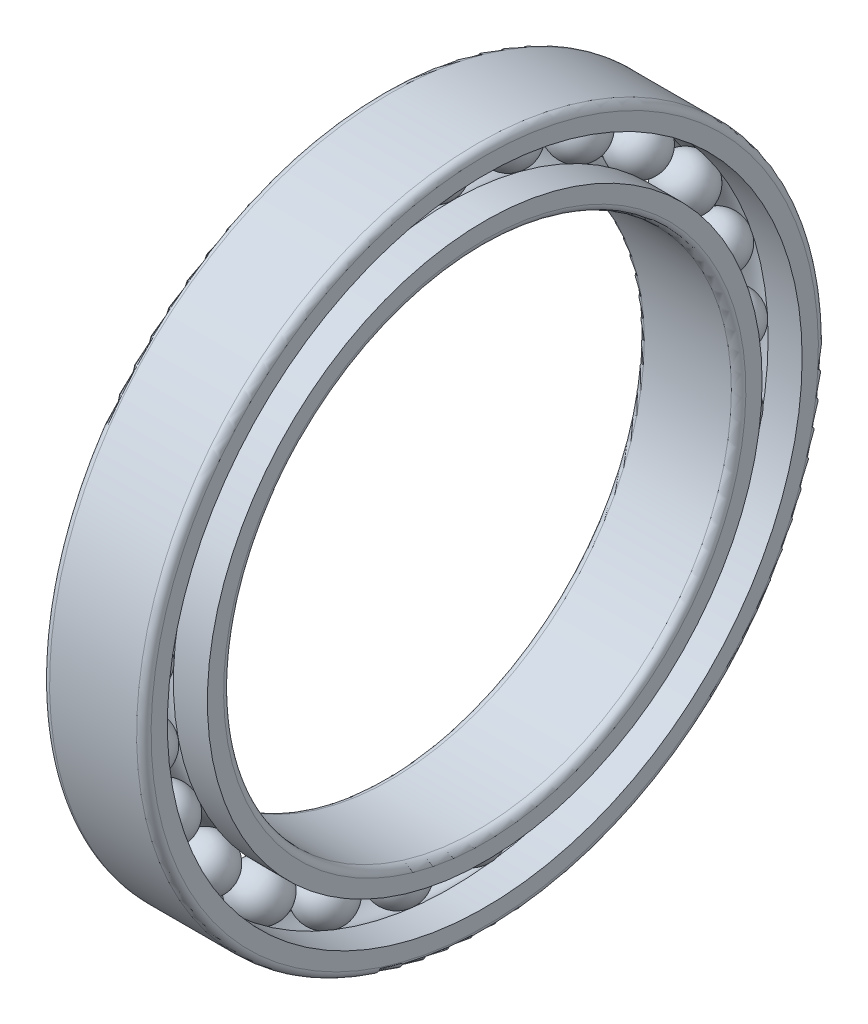
ISO-10303-21;
HEADER;
FILE_DESCRIPTION(('STEP AP214'),'2;1');
FILE_NAME('part.step','',(''),(''),'','','');
FILE_SCHEMA(('AUTOMOTIVE_DESIGN { 1 0 10303 214 1 1 1 1 }'));
ENDSEC;
DATA;
#1=APPLICATION_CONTEXT('core data for automotive mechanical design processes');
#2=APPLICATION_PROTOCOL_DEFINITION('international standard','automotive_design',2000,#1);
#3=PRODUCT_CONTEXT('',#1,'mechanical');
#4=PRODUCT('Part','Part','',(#3));
#5=PRODUCT_RELATED_PRODUCT_CATEGORY('part','',(#4));
#6=PRODUCT_DEFINITION_FORMATION('','',#4);
#7=PRODUCT_DEFINITION_CONTEXT('part definition',#1,'design');
#8=PRODUCT_DEFINITION('design','',#6,#7);
#9=PRODUCT_DEFINITION_SHAPE('','',#8);
#10=(LENGTH_UNIT() NAMED_UNIT(*) SI_UNIT(.MILLI.,.METRE.));
#11=(NAMED_UNIT(*) PLANE_ANGLE_UNIT() SI_UNIT($,.RADIAN.));
#12=(NAMED_UNIT(*) SI_UNIT($,.STERADIAN.) SOLID_ANGLE_UNIT());
#13=UNCERTAINTY_MEASURE_WITH_UNIT(LENGTH_MEASURE(1.E-05),#10,'distance_accuracy_value','');
#14=(GEOMETRIC_REPRESENTATION_CONTEXT(3) GLOBAL_UNCERTAINTY_ASSIGNED_CONTEXT((#13)) GLOBAL_UNIT_ASSIGNED_CONTEXT((#10,
#11,#12)) REPRESENTATION_CONTEXT('',''));
#15=CARTESIAN_POINT('',(0.,0.,0.));
#16=DIRECTION('',(0.,0.,1.));
#17=DIRECTION('',(1.,0.,0.));
#18=AXIS2_PLACEMENT_3D('',#15,#16,#17);
#19=CARTESIAN_POINT('',(0.,6.33484838468643,19.4966585840506));
#20=DIRECTION('',(1.,0.,0.));
#21=DIRECTION('',(0.,-0.951056516295154,0.309016994374948));
#22=AXIS2_PLACEMENT_3D('',#19,#20,#21);
#23=SPHERICAL_SURFACE('',#22,1.8);
#24=CARTESIAN_POINT('',(-1.79999999999999,6.33484838468643,19.4966585840506));
#25=VERTEX_POINT('',#24);
#26=VERTEX_LOOP('',#25);
#27=FACE_BOUND('',#26,.T.);
#28=CARTESIAN_POINT('',(1.80000000000001,6.33484838468643,19.4966585840506));
#29=VERTEX_POINT('',#28);
#30=VERTEX_LOOP('',#29);
#31=FACE_BOUND('',#30,.T.);
#32=ADVANCED_FACE('P0_F15',(#27,#31),#23,.T.);
#33=CLOSED_SHELL('',(#32));
#34=MANIFOLD_SOLID_BREP('P0_B1',#33);
#35=CARTESIAN_POINT('',(0.,-16.5848483846864,-12.0495976719957));
#36=DIRECTION('',(1.,0.,0.));
#37=DIRECTION('',(0.,0.587785252292473,-0.809016994374947));
#38=AXIS2_PLACEMENT_3D('',#35,#36,#37);
#39=SPHERICAL_SURFACE('',#38,1.8);
#40=CARTESIAN_POINT('',(-1.79999999999999,-16.5848483846864,-12.0495976719957));
#41=VERTEX_POINT('',#40);
#42=VERTEX_LOOP('',#41);
#43=FACE_BOUND('',#42,.T.);
#44=CARTESIAN_POINT('',(1.80000000000001,-16.5848483846864,-12.0495976719957));
#45=VERTEX_POINT('',#44);
#46=VERTEX_LOOP('',#45);
#47=FACE_BOUND('',#46,.T.);
#48=ADVANCED_FACE('P1_F15',(#43,#47),#39,.T.);
#49=CLOSED_SHELL('',(#48));
#50=MANIFOLD_SOLID_BREP('P1_B1',#49);
#51=CARTESIAN_POINT('',(0.,10.9844492970694,17.3087224727913));
#52=DIRECTION('',(1.,0.,0.));
#53=DIRECTION('',(0.,-0.844327925502015,0.535826794978997));
#54=AXIS2_PLACEMENT_3D('',#51,#52,#53);
#55=SPHERICAL_SURFACE('',#54,1.8);
#56=CARTESIAN_POINT('',(-1.79999999999999,10.9844492970694,17.3087224727913));
#57=VERTEX_POINT('',#56);
#58=VERTEX_LOOP('',#57);
#59=FACE_BOUND('',#58,.T.);
#60=CARTESIAN_POINT('',(1.80000000000001,10.9844492970694,17.3087224727913));
#61=VERTEX_POINT('',#60);
#62=VERTEX_LOOP('',#61);
#63=FACE_BOUND('',#62,.T.);
#64=ADVANCED_FACE('P2_F15',(#59,#63),#55,.T.);
#65=CLOSED_SHELL('',(#64));
#66=MANIFOLD_SOLID_BREP('P2_B1',#65);
#67=CARTESIAN_POINT('',(0.,-3.84131694900734,20.1368886399381));
#68=DIRECTION('',(1.,0.,0.));
#69=DIRECTION('',(0.,-0.982287250728689,-0.187381314585724));
#70=AXIS2_PLACEMENT_3D('',#67,#68,#69);
#71=SPHERICAL_SURFACE('',#70,1.8);
#72=CARTESIAN_POINT('',(-1.79999999999999,-3.84131694900734,20.1368886399381));
#73=VERTEX_POINT('',#72);
#74=VERTEX_LOOP('',#73);
#75=FACE_BOUND('',#74,.T.);
#76=CARTESIAN_POINT('',(1.80000000000001,-3.84131694900734,20.1368886399381));
#77=VERTEX_POINT('',#76);
#78=VERTEX_LOOP('',#77);
#79=FACE_BOUND('',#78,.T.);
#80=ADVANCED_FACE('P3_F15',(#75,#79),#71,.T.);
#81=CLOSED_SHELL('',(#80));
#82=MANIFOLD_SOLID_BREP('P3_B1',#81);
#83=CARTESIAN_POINT('',(0.,-19.0604179607092,-7.5465533300359));
#84=DIRECTION('',(1.,0.,0.));
#85=DIRECTION('',(0.,0.368124552684678,-0.929776485888252));
#86=AXIS2_PLACEMENT_3D('',#83,#84,#85);
#87=SPHERICAL_SURFACE('',#86,1.8);
#88=CARTESIAN_POINT('',(-1.79999999999999,-19.0604179607092,-7.5465533300359));
#89=VERTEX_POINT('',#88);
#90=VERTEX_LOOP('',#89);
#91=FACE_BOUND('',#90,.T.);
#92=CARTESIAN_POINT('',(1.80000000000001,-19.0604179607092,-7.5465533300359));
#93=VERTEX_POINT('',#92);
#94=VERTEX_LOOP('',#93);
#95=FACE_BOUND('',#94,.T.);
#96=ADVANCED_FACE('P4_F15',(#91,#95),#87,.T.);
#97=CLOSED_SHELL('',(#96));
#98=MANIFOLD_SOLID_BREP('P4_B1',#97);
#99=CARTESIAN_POINT('',(0.,1.28720565035093,20.4595479327796));
#100=DIRECTION('',(1.,0.,0.));
#101=DIRECTION('',(0.,-0.998026728428272,0.0627905195293136));
#102=AXIS2_PLACEMENT_3D('',#99,#100,#101);
#103=SPHERICAL_SURFACE('',#102,1.8);
#104=CARTESIAN_POINT('',(-1.79999999999999,1.28720565035093,20.4595479327796));
#105=VERTEX_POINT('',#104);
#106=VERTEX_LOOP('',#105);
#107=FACE_BOUND('',#106,.T.);
#108=CARTESIAN_POINT('',(1.80000000000001,1.28720565035093,20.4595479327796));
#109=VERTEX_POINT('',#108);
#110=VERTEX_LOOP('',#109);
#111=FACE_BOUND('',#110,.T.);
#112=ADVANCED_FACE('P5_F15',(#107,#111),#103,.T.);
#113=CLOSED_SHELL('',(#112));
#114=MANIFOLD_SOLID_BREP('P5_B1',#113);
#115=CARTESIAN_POINT('',(0.,-13.0671917898481,-15.7955214769037));
#116=DIRECTION('',(1.,0.,0.));
#117=DIRECTION('',(0.,0.770513242775789,-0.63742398974869));
#118=AXIS2_PLACEMENT_3D('',#115,#116,#117);
#119=SPHERICAL_SURFACE('',#118,1.8);
#120=CARTESIAN_POINT('',(-1.79999999999999,-13.0671917898481,-15.7955214769037));
#121=VERTEX_POINT('',#120);
#122=VERTEX_LOOP('',#121);
#123=FACE_BOUND('',#122,.T.);
#124=CARTESIAN_POINT('',(1.80000000000001,-13.0671917898481,-15.7955214769037));
#125=VERTEX_POINT('',#124);
#126=VERTEX_LOOP('',#125);
#127=FACE_BOUND('',#126,.T.);
#128=ADVANCED_FACE('P6_F15',(#123,#127),#119,.T.);
#129=CLOSED_SHELL('',(#128));
#130=MANIFOLD_SOLID_BREP('P6_B1',#129);
#131=CARTESIAN_POINT('',(0.,-8.72847547708399,-18.5489545755534));
#132=DIRECTION('',(1.,0.,0.));
#133=DIRECTION('',(0.,0.90482705246602,-0.425779291565073));
#134=AXIS2_PLACEMENT_3D('',#131,#132,#133);
#135=SPHERICAL_SURFACE('',#134,1.8);
#136=CARTESIAN_POINT('',(-1.79999999999999,-8.72847547708399,-18.5489545755534));
#137=VERTEX_POINT('',#136);
#138=VERTEX_LOOP('',#137);
#139=FACE_BOUND('',#138,.T.);
#140=CARTESIAN_POINT('',(1.80000000000001,-8.72847547708399,-18.5489545755534));
#141=VERTEX_POINT('',#140);
#142=VERTEX_LOOP('',#141);
#143=FACE_BOUND('',#142,.T.);
#144=ADVANCED_FACE('P7_F15',(#139,#143),#135,.T.);
#145=CLOSED_SHELL('',(#144));
#146=MANIFOLD_SOLID_BREP('P7_B1',#145);
#147=CARTESIAN_POINT('',(0.,-3.84131694900736,-20.1368886399381));
#148=DIRECTION('',(1.,0.,0.));
#149=DIRECTION('',(0.,0.982287250728689,-0.187381314585725));
#150=AXIS2_PLACEMENT_3D('',#147,#148,#149);
#151=SPHERICAL_SURFACE('',#150,1.8);
#152=CARTESIAN_POINT('',(-1.79999999999999,-3.84131694900736,-20.1368886399381));
#153=VERTEX_POINT('',#152);
#154=VERTEX_LOOP('',#153);
#155=FACE_BOUND('',#154,.T.);
#156=CARTESIAN_POINT('',(1.80000000000001,-3.84131694900736,-20.1368886399381));
#157=VERTEX_POINT('',#156);
#158=VERTEX_LOOP('',#157);
#159=FACE_BOUND('',#158,.T.);
#160=ADVANCED_FACE('P8_F15',(#155,#159),#151,.T.);
#161=CLOSED_SHELL('',(#160));
#162=MANIFOLD_SOLID_BREP('P8_B1',#161);
#163=CARTESIAN_POINT('',(0.,1.28720565035092,-20.4595479327796));
#164=DIRECTION('',(1.,0.,0.));
#165=DIRECTION('',(0.,0.998026728428272,0.0627905195293134));
#166=AXIS2_PLACEMENT_3D('',#163,#164,#165);
#167=SPHERICAL_SURFACE('',#166,1.8);
#168=CARTESIAN_POINT('',(-1.79999999999999,1.28720565035092,-20.4595479327796));
#169=VERTEX_POINT('',#168);
#170=VERTEX_LOOP('',#169);
#171=FACE_BOUND('',#170,.T.);
#172=CARTESIAN_POINT('',(1.80000000000001,1.28720565035092,-20.4595479327796));
#173=VERTEX_POINT('',#172);
#174=VERTEX_LOOP('',#173);
#175=FACE_BOUND('',#174,.T.);
#176=ADVANCED_FACE('P9_F15',(#171,#175),#167,.T.);
#177=CLOSED_SHELL('',(#176));
#178=MANIFOLD_SOLID_BREP('P9_B1',#177);
#179=CARTESIAN_POINT('',(0.,6.33484838468643,-19.4966585840506));
#180=DIRECTION('',(1.,0.,0.));
#181=DIRECTION('',(0.,0.951056516295154,0.309016994374948));
#182=AXIS2_PLACEMENT_3D('',#179,#180,#181);
#183=SPHERICAL_SURFACE('',#182,1.8);
#184=CARTESIAN_POINT('',(-1.79999999999999,6.33484838468643,-19.4966585840506));
#185=VERTEX_POINT('',#184);
#186=VERTEX_LOOP('',#185);
#187=FACE_BOUND('',#186,.T.);
#188=CARTESIAN_POINT('',(1.80000000000001,6.33484838468643,-19.4966585840506));
#189=VERTEX_POINT('',#188);
#190=VERTEX_LOOP('',#189);
#191=FACE_BOUND('',#190,.T.);
#192=ADVANCED_FACE('P10_F15',(#187,#191),#183,.T.);
#193=CLOSED_SHELL('',(#192));
#194=MANIFOLD_SOLID_BREP('P10_B1',#193);
#195=CARTESIAN_POINT('',(0.,10.9844492970694,-17.3087224727913));
#196=DIRECTION('',(1.,0.,0.));
#197=DIRECTION('',(0.,0.844327925502015,0.535826794978997));
#198=AXIS2_PLACEMENT_3D('',#195,#196,#197);
#199=SPHERICAL_SURFACE('',#198,1.8);
#200=CARTESIAN_POINT('',(-1.79999999999999,10.9844492970694,-17.3087224727913));
#201=VERTEX_POINT('',#200);
#202=VERTEX_LOOP('',#201);
#203=FACE_BOUND('',#202,.T.);
#204=CARTESIAN_POINT('',(1.80000000000001,10.9844492970694,-17.3087224727913));
#205=VERTEX_POINT('',#204);
#206=VERTEX_LOOP('',#205);
#207=FACE_BOUND('',#206,.T.);
#208=ADVANCED_FACE('P11_F15',(#203,#207),#199,.T.);
#209=CLOSED_SHELL('',(#208));
#210=MANIFOLD_SOLID_BREP('P11_B1',#209);
#211=CARTESIAN_POINT('',(0.,14.9438568621389,-14.0332156715381));
#212=DIRECTION('',(1.,0.,0.));
#213=DIRECTION('',(0.,0.684547105928689,0.728968627421412));
#214=AXIS2_PLACEMENT_3D('',#211,#212,#213);
#215=SPHERICAL_SURFACE('',#214,1.8);
#216=CARTESIAN_POINT('',(-1.79999999999999,14.9438568621389,-14.0332156715381));
#217=VERTEX_POINT('',#216);
#218=VERTEX_LOOP('',#217);
#219=FACE_BOUND('',#218,.T.);
#220=CARTESIAN_POINT('',(1.80000000000001,14.9438568621389,-14.0332156715381));
#221=VERTEX_POINT('',#220);
#222=VERTEX_LOOP('',#221);
#223=FACE_BOUND('',#222,.T.);
#224=ADVANCED_FACE('P12_F15',(#219,#223),#215,.T.);
#225=CLOSED_SHELL('',(#224));
#226=MANIFOLD_SOLID_BREP('P12_B1',#225);
#227=CARTESIAN_POINT('',(0.,17.9642869408992,-9.87595031908516));
#228=DIRECTION('',(1.,0.,0.));
#229=DIRECTION('',(0.,0.481753674101715,0.876306680043864));
#230=AXIS2_PLACEMENT_3D('',#227,#228,#229);
#231=SPHERICAL_SURFACE('',#230,1.8);
#232=CARTESIAN_POINT('',(-1.79999999999999,17.9642869408992,-9.87595031908516));
#233=VERTEX_POINT('',#232);
#234=VERTEX_LOOP('',#233);
#235=FACE_BOUND('',#234,.T.);
#236=CARTESIAN_POINT('',(1.80000000000001,17.9642869408992,-9.87595031908516));
#237=VERTEX_POINT('',#236);
#238=VERTEX_LOOP('',#237);
#239=FACE_BOUND('',#238,.T.);
#240=ADVANCED_FACE('P13_F15',(#235,#239),#231,.T.);
#241=CLOSED_SHELL('',(#240));
#242=MANIFOLD_SOLID_BREP('P13_B1',#241);
#243=CARTESIAN_POINT('',(0.,19.8559548031369,-5.09814268687953));
#244=DIRECTION('',(1.,0.,0.));
#245=DIRECTION('',(0.,0.248689887164855,0.968583161128631));
#246=AXIS2_PLACEMENT_3D('',#243,#244,#245);
#247=SPHERICAL_SURFACE('',#246,1.8);
#248=CARTESIAN_POINT('',(-1.79999999999999,19.8559548031369,-5.09814268687953));
#249=VERTEX_POINT('',#248);
#250=VERTEX_LOOP('',#249);
#251=FACE_BOUND('',#250,.T.);
#252=CARTESIAN_POINT('',(1.80000000000001,19.8559548031369,-5.09814268687953));
#253=VERTEX_POINT('',#252);
#254=VERTEX_LOOP('',#253);
#255=FACE_BOUND('',#254,.T.);
#256=ADVANCED_FACE('P14_F15',(#251,#255),#247,.T.);
#257=CLOSED_SHELL('',(#256));
#258=MANIFOLD_SOLID_BREP('P14_B1',#257);
#259=CARTESIAN_POINT('',(0.,20.5,0.));
#260=DIRECTION('',(1.,0.,0.));
#261=DIRECTION('',(0.,0.,1.));
#262=AXIS2_PLACEMENT_3D('',#259,#260,#261);
#263=SPHERICAL_SURFACE('',#262,1.8);
#264=CARTESIAN_POINT('',(-1.79999999999999,20.5,0.));
#265=VERTEX_POINT('',#264);
#266=VERTEX_LOOP('',#265);
#267=FACE_BOUND('',#266,.T.);
#268=CARTESIAN_POINT('',(1.80000000000001,20.5,0.));
#269=VERTEX_POINT('',#268);
#270=VERTEX_LOOP('',#269);
#271=FACE_BOUND('',#270,.T.);
#272=ADVANCED_FACE('P15_F15',(#267,#271),#263,.T.);
#273=CLOSED_SHELL('',(#272));
#274=MANIFOLD_SOLID_BREP('P15_B1',#273);
#275=CARTESIAN_POINT('',(0.,0.,0.));
#276=DIRECTION('',(1.,0.,0.));
#277=DIRECTION('',(0.,1.,0.));
#278=AXIS2_PLACEMENT_3D('',#275,#276,#277);
#279=TOROIDAL_SURFACE('',#278,20.5,1.8);
#280=CARTESIAN_POINT('',(-1.1556816170555,0.,0.));
#281=DIRECTION('',(1.,0.,0.));
#282=DIRECTION('',(0.,0.,-1.));
#283=AXIS2_PLACEMENT_3D('',#280,#281,#282);
#284=CIRCLE('',#283,21.88);
#285=CARTESIAN_POINT('',(-1.1556816170555,0.,-21.88));
#286=VERTEX_POINT('',#285);
#287=EDGE_CURVE('P16_E109',#286,#286,#284,.F.);
#288=ORIENTED_EDGE('',*,*,#287,.T.);
#289=EDGE_LOOP('',(#288));
#290=FACE_BOUND('',#289,.T.);
#291=CARTESIAN_POINT('',(1.1556816170555,0.,0.));
#292=DIRECTION('',(1.,0.,0.));
#293=DIRECTION('',(0.,0.,-1.));
#294=AXIS2_PLACEMENT_3D('',#291,#292,#293);
#295=CIRCLE('',#294,21.88);
#296=CARTESIAN_POINT('',(1.1556816170555,0.,-21.88));
#297=VERTEX_POINT('',#296);
#298=EDGE_CURVE('P16_E114',#297,#297,#295,.T.);
#299=ORIENTED_EDGE('',*,*,#298,.T.);
#300=EDGE_LOOP('',(#299));
#301=FACE_BOUND('',#300,.T.);
#302=ADVANCED_FACE('P16_F14',(#290,#301),#279,.F.);
#303=CARTESIAN_POINT('',(3.50000000000002,0.,0.));
#304=DIRECTION('',(1.,0.,0.));
#305=DIRECTION('',(0.,0.,-1.));
#306=AXIS2_PLACEMENT_3D('',#303,#304,#305);
#307=CYLINDRICAL_SURFACE('',#306,21.88);
#308=ORIENTED_EDGE('',*,*,#298,.F.);
#309=EDGE_LOOP('',(#308));
#310=FACE_BOUND('',#309,.T.);
#311=CARTESIAN_POINT('',(3.50000000000002,0.,0.));
#312=DIRECTION('',(1.,0.,0.));
#313=DIRECTION('',(0.,0.,-1.));
#314=AXIS2_PLACEMENT_3D('',#311,#312,#313);
#315=CIRCLE('',#314,21.88);
#316=CARTESIAN_POINT('',(3.50000000000002,0.,-21.88));
#317=VERTEX_POINT('',#316);
#318=EDGE_CURVE('P16_E18',#317,#317,#315,.F.);
#319=ORIENTED_EDGE('',*,*,#318,.F.);
#320=EDGE_LOOP('',(#319));
#321=FACE_BOUND('',#320,.T.);
#322=ADVANCED_FACE('P16_F85',(#310,#321),#307,.F.);
#323=CARTESIAN_POINT('',(3.50000000000002,0.,0.));
#324=DIRECTION('',(1.,0.,0.));
#325=DIRECTION('',(0.,0.,-1.));
#326=AXIS2_PLACEMENT_3D('',#323,#324,#325);
#327=CYLINDRICAL_SURFACE('',#326,21.88);
#328=CARTESIAN_POINT('',(-3.49999999999998,0.,0.));
#329=DIRECTION('',(1.,0.,0.));
#330=DIRECTION('',(0.,0.,-1.));
#331=AXIS2_PLACEMENT_3D('',#328,#329,#330);
#332=CIRCLE('',#331,21.88);
#333=CARTESIAN_POINT('',(-3.49999999999998,0.,-21.88));
#334=VERTEX_POINT('',#333);
#335=EDGE_CURVE('P16_E104',#334,#334,#332,.T.);
#336=ORIENTED_EDGE('',*,*,#335,.F.);
#337=EDGE_LOOP('',(#336));
#338=FACE_BOUND('',#337,.T.);
#339=ORIENTED_EDGE('',*,*,#287,.F.);
#340=EDGE_LOOP('',(#339));
#341=FACE_BOUND('',#340,.T.);
#342=ADVANCED_FACE('P16_F81',(#338,#341),#327,.F.);
#343=CARTESIAN_POINT('',(3.50000000000002,0.,0.));
#344=DIRECTION('',(1.,0.,0.));
#345=DIRECTION('',(0.,0.,-1.));
#346=AXIS2_PLACEMENT_3D('',#343,#344,#345);
#347=PLANE('',#346);
#348=ORIENTED_EDGE('',*,*,#318,.T.);
#349=EDGE_LOOP('',(#348));
#350=FACE_BOUND('',#349,.T.);
#351=CARTESIAN_POINT('',(3.50000000000002,0.,0.));
#352=DIRECTION('',(-1.,0.,0.));
#353=DIRECTION('',(0.,1.,0.));
#354=AXIS2_PLACEMENT_3D('',#351,#352,#353);
#355=CIRCLE('',#354,23.);
#356=CARTESIAN_POINT('',(3.50000000000002,23.,0.));
#357=VERTEX_POINT('',#356);
#358=EDGE_CURVE('P16_E65',#357,#357,#355,.T.);
#359=ORIENTED_EDGE('',*,*,#358,.F.);
#360=EDGE_LOOP('',(#359));
#361=FACE_BOUND('',#360,.T.);
#362=ADVANCED_FACE('P16_F71',(#350,#361),#347,.T.);
#363=CARTESIAN_POINT('',(-3.49999999999998,0.,0.));
#364=DIRECTION('',(-1.,0.,0.));
#365=DIRECTION('',(0.,0.,1.));
#366=AXIS2_PLACEMENT_3D('',#363,#364,#365);
#367=PLANE('',#366);
#368=ORIENTED_EDGE('',*,*,#335,.T.);
#369=EDGE_LOOP('',(#368));
#370=FACE_BOUND('',#369,.T.);
#371=CARTESIAN_POINT('',(-3.49999999999998,0.,0.));
#372=DIRECTION('',(1.,0.,0.));
#373=DIRECTION('',(0.,1.,0.));
#374=AXIS2_PLACEMENT_3D('',#371,#372,#373);
#375=CIRCLE('',#374,23.);
#376=CARTESIAN_POINT('',(-3.49999999999998,23.,0.));
#377=VERTEX_POINT('',#376);
#378=EDGE_CURVE('P16_E27',#377,#377,#375,.T.);
#379=ORIENTED_EDGE('',*,*,#378,.F.);
#380=EDGE_LOOP('',(#379));
#381=FACE_BOUND('',#380,.T.);
#382=ADVANCED_FACE('P16_F80',(#370,#381),#367,.T.);
#383=CARTESIAN_POINT('',(3.00000000000002,0.,0.));
#384=DIRECTION('',(1.,0.,0.));
#385=DIRECTION('',(0.,1.,0.));
#386=AXIS2_PLACEMENT_3D('',#383,#384,#385);
#387=TOROIDAL_SURFACE('',#386,23.,0.5);
#388=CARTESIAN_POINT('',(3.00000000000002,0.,0.));
#389=DIRECTION('',(1.,0.,0.));
#390=DIRECTION('',(0.,0.,-1.));
#391=AXIS2_PLACEMENT_3D('',#388,#389,#390);
#392=CIRCLE('',#391,23.5);
#393=CARTESIAN_POINT('',(3.00000000000002,0.,-23.5));
#394=VERTEX_POINT('',#393);
#395=EDGE_CURVE('P16_E22',#394,#394,#392,.F.);
#396=ORIENTED_EDGE('',*,*,#395,.F.);
#397=EDGE_LOOP('',(#396));
#398=FACE_BOUND('',#397,.T.);
#399=ORIENTED_EDGE('',*,*,#358,.T.);
#400=EDGE_LOOP('',(#399));
#401=FACE_BOUND('',#400,.T.);
#402=ADVANCED_FACE('P16_F45',(#398,#401),#387,.T.);
#403=CARTESIAN_POINT('',(-2.99999999999998,0.,0.));
#404=DIRECTION('',(1.,0.,0.));
#405=DIRECTION('',(0.,1.,0.));
#406=AXIS2_PLACEMENT_3D('',#403,#404,#405);
#407=TOROIDAL_SURFACE('',#406,23.,0.5);
#408=ORIENTED_EDGE('',*,*,#378,.T.);
#409=EDGE_LOOP('',(#408));
#410=FACE_BOUND('',#409,.T.);
#411=CARTESIAN_POINT('',(-2.99999999999998,0.,0.));
#412=DIRECTION('',(1.,0.,0.));
#413=DIRECTION('',(0.,0.,-1.));
#414=AXIS2_PLACEMENT_3D('',#411,#412,#413);
#415=CIRCLE('',#414,23.5);
#416=CARTESIAN_POINT('',(-2.99999999999998,0.,-23.5));
#417=VERTEX_POINT('',#416);
#418=EDGE_CURVE('P16_E10',#417,#417,#415,.T.);
#419=ORIENTED_EDGE('',*,*,#418,.F.);
#420=EDGE_LOOP('',(#419));
#421=FACE_BOUND('',#420,.T.);
#422=ADVANCED_FACE('P16_F39',(#410,#421),#407,.T.);
#423=CARTESIAN_POINT('',(-3.49999999999998,0.,0.));
#424=DIRECTION('',(1.,0.,0.));
#425=DIRECTION('',(0.,0.,-1.));
#426=AXIS2_PLACEMENT_3D('',#423,#424,#425);
#427=CYLINDRICAL_SURFACE('',#426,23.5);
#428=ORIENTED_EDGE('',*,*,#418,.T.);
#429=EDGE_LOOP('',(#428));
#430=FACE_BOUND('',#429,.T.);
#431=ORIENTED_EDGE('',*,*,#395,.T.);
#432=EDGE_LOOP('',(#431));
#433=FACE_BOUND('',#432,.T.);
#434=ADVANCED_FACE('P16_F44',(#430,#433),#427,.T.);
#435=CLOSED_SHELL('',(#302,#322,#342,#362,#382,#402,#422,#434));
#436=MANIFOLD_SOLID_BREP('P16_B1',#435);
#437=CARTESIAN_POINT('',(0.,17.9642869408992,9.87595031908516));
#438=DIRECTION('',(1.,0.,0.));
#439=DIRECTION('',(0.,-0.481753674101715,0.876306680043864));
#440=AXIS2_PLACEMENT_3D('',#437,#438,#439);
#441=SPHERICAL_SURFACE('',#440,1.8);
#442=CARTESIAN_POINT('',(-1.79999999999999,17.9642869408992,9.87595031908516));
#443=VERTEX_POINT('',#442);
#444=VERTEX_LOOP('',#443);
#445=FACE_BOUND('',#444,.T.);
#446=CARTESIAN_POINT('',(1.80000000000001,17.9642869408992,9.87595031908516));
#447=VERTEX_POINT('',#446);
#448=VERTEX_LOOP('',#447);
#449=FACE_BOUND('',#448,.T.);
#450=ADVANCED_FACE('P17_F15',(#445,#449),#441,.T.);
#451=CLOSED_SHELL('',(#450));
#452=MANIFOLD_SOLID_BREP('P17_B1',#451);
#453=CARTESIAN_POINT('',(0.,-20.3383513769468,2.56933128806823));
#454=DIRECTION('',(1.,0.,0.));
#455=DIRECTION('',(0.,-0.125333233564304,-0.992114701314478));
#456=AXIS2_PLACEMENT_3D('',#453,#454,#455);
#457=SPHERICAL_SURFACE('',#456,1.8);
#458=CARTESIAN_POINT('',(-1.79999999999999,-20.3383513769468,2.56933128806823));
#459=VERTEX_POINT('',#458);
#460=VERTEX_LOOP('',#459);
#461=FACE_BOUND('',#460,.T.);
#462=CARTESIAN_POINT('',(1.80000000000001,-20.3383513769468,2.56933128806823));
#463=VERTEX_POINT('',#462);
#464=VERTEX_LOOP('',#463);
#465=FACE_BOUND('',#464,.T.);
#466=ADVANCED_FACE('P18_F15',(#461,#465),#457,.T.);
#467=CLOSED_SHELL('',(#466));
#468=MANIFOLD_SOLID_BREP('P18_B1',#467);
#469=CARTESIAN_POINT('',(0.,0.,0.));
#470=DIRECTION('',(1.,0.,0.));
#471=DIRECTION('',(0.,1.,0.));
#472=AXIS2_PLACEMENT_3D('',#469,#470,#471);
#473=TOROIDAL_SURFACE('',#472,20.5,1.8);
#474=CARTESIAN_POINT('',(-1.15568161705549,0.,0.));
#475=DIRECTION('',(1.,0.,0.));
#476=DIRECTION('',(0.,0.,-1.));
#477=AXIS2_PLACEMENT_3D('',#474,#475,#476);
#478=CIRCLE('',#477,19.12);
#479=CARTESIAN_POINT('',(-1.15568161705549,0.,-19.12));
#480=VERTEX_POINT('',#479);
#481=EDGE_CURVE('P19_E109',#480,#480,#478,.F.);
#482=ORIENTED_EDGE('',*,*,#481,.F.);
#483=EDGE_LOOP('',(#482));
#484=FACE_BOUND('',#483,.T.);
#485=CARTESIAN_POINT('',(1.15568161705549,0.,0.));
#486=DIRECTION('',(1.,0.,0.));
#487=DIRECTION('',(0.,0.,-1.));
#488=AXIS2_PLACEMENT_3D('',#485,#486,#487);
#489=CIRCLE('',#488,19.12);
#490=CARTESIAN_POINT('',(1.15568161705549,0.,-19.12));
#491=VERTEX_POINT('',#490);
#492=EDGE_CURVE('P19_E114',#491,#491,#489,.T.);
#493=ORIENTED_EDGE('',*,*,#492,.F.);
#494=EDGE_LOOP('',(#493));
#495=FACE_BOUND('',#494,.T.);
#496=ADVANCED_FACE('P19_F14',(#484,#495),#473,.F.);
#497=CARTESIAN_POINT('',(-3.49999999999999,0.,0.));
#498=DIRECTION('',(1.,0.,0.));
#499=DIRECTION('',(0.,0.,-1.));
#500=AXIS2_PLACEMENT_3D('',#497,#498,#499);
#501=CYLINDRICAL_SURFACE('',#500,19.12);
#502=ORIENTED_EDGE('',*,*,#492,.T.);
#503=EDGE_LOOP('',(#502));
#504=FACE_BOUND('',#503,.T.);
#505=CARTESIAN_POINT('',(3.5,0.,0.));
#506=DIRECTION('',(1.,0.,0.));
#507=DIRECTION('',(0.,0.,-1.));
#508=AXIS2_PLACEMENT_3D('',#505,#506,#507);
#509=CIRCLE('',#508,19.12);
#510=CARTESIAN_POINT('',(3.5,0.,-19.12));
#511=VERTEX_POINT('',#510);
#512=EDGE_CURVE('P19_E18',#511,#511,#509,.T.);
#513=ORIENTED_EDGE('',*,*,#512,.F.);
#514=EDGE_LOOP('',(#513));
#515=FACE_BOUND('',#514,.T.);
#516=ADVANCED_FACE('P19_F84',(#504,#515),#501,.T.);
#517=CARTESIAN_POINT('',(-3.49999999999999,0.,0.));
#518=DIRECTION('',(1.,0.,0.));
#519=DIRECTION('',(0.,0.,-1.));
#520=AXIS2_PLACEMENT_3D('',#517,#518,#519);
#521=CYLINDRICAL_SURFACE('',#520,19.12);
#522=CARTESIAN_POINT('',(-3.49999999999999,0.,0.));
#523=DIRECTION('',(1.,0.,0.));
#524=DIRECTION('',(0.,0.,-1.));
#525=AXIS2_PLACEMENT_3D('',#522,#523,#524);
#526=CIRCLE('',#525,19.12);
#527=CARTESIAN_POINT('',(-3.49999999999999,0.,-19.12));
#528=VERTEX_POINT('',#527);
#529=EDGE_CURVE('P19_E104',#528,#528,#526,.F.);
#530=ORIENTED_EDGE('',*,*,#529,.F.);
#531=EDGE_LOOP('',(#530));
#532=FACE_BOUND('',#531,.T.);
#533=ORIENTED_EDGE('',*,*,#481,.T.);
#534=EDGE_LOOP('',(#533));
#535=FACE_BOUND('',#534,.T.);
#536=ADVANCED_FACE('P19_F81',(#532,#535),#521,.T.);
#537=CARTESIAN_POINT('',(3.50000000000001,0.,0.));
#538=DIRECTION('',(1.,0.,0.));
#539=DIRECTION('',(0.,0.,-1.));
#540=AXIS2_PLACEMENT_3D('',#537,#538,#539);
#541=PLANE('',#540);
#542=CARTESIAN_POINT('',(3.50000000000001,0.,0.));
#543=DIRECTION('',(1.,0.,0.));
#544=DIRECTION('',(0.,1.,0.));
#545=AXIS2_PLACEMENT_3D('',#542,#543,#544);
#546=CIRCLE('',#545,18.);
#547=CARTESIAN_POINT('',(3.50000000000001,18.,0.));
#548=VERTEX_POINT('',#547);
#549=EDGE_CURVE('P19_E65',#548,#548,#546,.T.);
#550=ORIENTED_EDGE('',*,*,#549,.F.);
#551=EDGE_LOOP('',(#550));
#552=FACE_BOUND('',#551,.T.);
#553=ORIENTED_EDGE('',*,*,#512,.T.);
#554=EDGE_LOOP('',(#553));
#555=FACE_BOUND('',#554,.T.);
#556=ADVANCED_FACE('P19_F71',(#552,#555),#541,.T.);
#557=CARTESIAN_POINT('',(-3.49999999999999,0.,0.));
#558=DIRECTION('',(-1.,0.,0.));
#559=DIRECTION('',(0.,0.,1.));
#560=AXIS2_PLACEMENT_3D('',#557,#558,#559);
#561=PLANE('',#560);
#562=CARTESIAN_POINT('',(-3.49999999999999,0.,0.));
#563=DIRECTION('',(-1.,0.,0.));
#564=DIRECTION('',(0.,1.,0.));
#565=AXIS2_PLACEMENT_3D('',#562,#563,#564);
#566=CIRCLE('',#565,18.);
#567=CARTESIAN_POINT('',(-3.49999999999999,18.,0.));
#568=VERTEX_POINT('',#567);
#569=EDGE_CURVE('P19_E27',#568,#568,#566,.T.);
#570=ORIENTED_EDGE('',*,*,#569,.F.);
#571=EDGE_LOOP('',(#570));
#572=FACE_BOUND('',#571,.T.);
#573=ORIENTED_EDGE('',*,*,#529,.T.);
#574=EDGE_LOOP('',(#573));
#575=FACE_BOUND('',#574,.T.);
#576=ADVANCED_FACE('P19_F80',(#572,#575),#561,.T.);
#577=CARTESIAN_POINT('',(3.00000000000001,0.,0.));
#578=DIRECTION('',(1.,0.,0.));
#579=DIRECTION('',(0.,1.,0.));
#580=AXIS2_PLACEMENT_3D('',#577,#578,#579);
#581=TOROIDAL_SURFACE('',#580,18.,0.5);
#582=CARTESIAN_POINT('',(3.00000000000001,0.,0.));
#583=DIRECTION('',(1.,0.,0.));
#584=DIRECTION('',(0.,0.,-1.));
#585=AXIS2_PLACEMENT_3D('',#582,#583,#584);
#586=CIRCLE('',#585,17.5);
#587=CARTESIAN_POINT('',(3.00000000000001,0.,-17.5));
#588=VERTEX_POINT('',#587);
#589=EDGE_CURVE('P19_E22',#588,#588,#586,.F.);
#590=ORIENTED_EDGE('',*,*,#589,.T.);
#591=EDGE_LOOP('',(#590));
#592=FACE_BOUND('',#591,.T.);
#593=ORIENTED_EDGE('',*,*,#549,.T.);
#594=EDGE_LOOP('',(#593));
#595=FACE_BOUND('',#594,.T.);
#596=ADVANCED_FACE('P19_F45',(#592,#595),#581,.T.);
#597=CARTESIAN_POINT('',(-2.99999999999999,0.,0.));
#598=DIRECTION('',(1.,0.,0.));
#599=DIRECTION('',(0.,1.,0.));
#600=AXIS2_PLACEMENT_3D('',#597,#598,#599);
#601=TOROIDAL_SURFACE('',#600,18.,0.5);
#602=ORIENTED_EDGE('',*,*,#569,.T.);
#603=EDGE_LOOP('',(#602));
#604=FACE_BOUND('',#603,.T.);
#605=CARTESIAN_POINT('',(-2.99999999999999,0.,0.));
#606=DIRECTION('',(1.,0.,0.));
#607=DIRECTION('',(0.,0.,-1.));
#608=AXIS2_PLACEMENT_3D('',#605,#606,#607);
#609=CIRCLE('',#608,17.5);
#610=CARTESIAN_POINT('',(-2.99999999999999,0.,-17.5));
#611=VERTEX_POINT('',#610);
#612=EDGE_CURVE('P19_E10',#611,#611,#609,.T.);
#613=ORIENTED_EDGE('',*,*,#612,.T.);
#614=EDGE_LOOP('',(#613));
#615=FACE_BOUND('',#614,.T.);
#616=ADVANCED_FACE('P19_F39',(#604,#615),#601,.T.);
#617=CARTESIAN_POINT('',(3.50000000000001,0.,0.));
#618=DIRECTION('',(1.,0.,0.));
#619=DIRECTION('',(0.,0.,-1.));
#620=AXIS2_PLACEMENT_3D('',#617,#618,#619);
#621=CYLINDRICAL_SURFACE('',#620,17.5);
#622=ORIENTED_EDGE('',*,*,#612,.F.);
#623=EDGE_LOOP('',(#622));
#624=FACE_BOUND('',#623,.T.);
#625=ORIENTED_EDGE('',*,*,#589,.F.);
#626=EDGE_LOOP('',(#625));
#627=FACE_BOUND('',#626,.T.);
#628=ADVANCED_FACE('P19_F44',(#624,#627),#621,.F.);
#629=CLOSED_SHELL('',(#496,#516,#536,#556,#576,#596,#616,#628));
#630=MANIFOLD_SOLID_BREP('P19_B1',#629);
#631=CARTESIAN_POINT('',(0.,-16.5848483846864,12.0495976719957));
#632=DIRECTION('',(1.,0.,0.));
#633=DIRECTION('',(0.,-0.587785252292473,-0.809016994374947));
#634=AXIS2_PLACEMENT_3D('',#631,#632,#633);
#635=SPHERICAL_SURFACE('',#634,1.8);
#636=CARTESIAN_POINT('',(-1.79999999999999,-16.5848483846864,12.0495976719957));
#637=VERTEX_POINT('',#636);
#638=VERTEX_LOOP('',#637);
#639=FACE_BOUND('',#638,.T.);
#640=CARTESIAN_POINT('',(1.80000000000001,-16.5848483846864,12.0495976719957));
#641=VERTEX_POINT('',#640);
#642=VERTEX_LOOP('',#641);
#643=FACE_BOUND('',#642,.T.);
#644=ADVANCED_FACE('P20_F15',(#639,#643),#635,.T.);
#645=CLOSED_SHELL('',(#644));
#646=MANIFOLD_SOLID_BREP('P20_B1',#645);
#647=CARTESIAN_POINT('',(0.,-8.72847547708399,18.5489545755534));
#648=DIRECTION('',(1.,0.,0.));
#649=DIRECTION('',(0.,-0.90482705246602,-0.425779291565073));
#650=AXIS2_PLACEMENT_3D('',#647,#648,#649);
#651=SPHERICAL_SURFACE('',#650,1.8);
#652=CARTESIAN_POINT('',(-1.79999999999999,-8.72847547708399,18.5489545755534));
#653=VERTEX_POINT('',#652);
#654=VERTEX_LOOP('',#653);
#655=FACE_BOUND('',#654,.T.);
#656=CARTESIAN_POINT('',(1.80000000000001,-8.72847547708399,18.5489545755534));
#657=VERTEX_POINT('',#656);
#658=VERTEX_LOOP('',#657);
#659=FACE_BOUND('',#658,.T.);
#660=ADVANCED_FACE('P21_F15',(#655,#659),#651,.T.);
#661=CLOSED_SHELL('',(#660));
#662=MANIFOLD_SOLID_BREP('P21_B1',#661);
#663=CARTESIAN_POINT('',(0.,-13.0671917898481,15.7955214769037));
#664=DIRECTION('',(1.,0.,0.));
#665=DIRECTION('',(0.,-0.770513242775789,-0.63742398974869));
#666=AXIS2_PLACEMENT_3D('',#663,#664,#665);
#667=SPHERICAL_SURFACE('',#666,1.8);
#668=CARTESIAN_POINT('',(-1.79999999999999,-13.0671917898481,15.7955214769037));
#669=VERTEX_POINT('',#668);
#670=VERTEX_LOOP('',#669);
#671=FACE_BOUND('',#670,.T.);
#672=CARTESIAN_POINT('',(1.80000000000001,-13.0671917898481,15.7955214769037));
#673=VERTEX_POINT('',#672);
#674=VERTEX_LOOP('',#673);
#675=FACE_BOUND('',#674,.T.);
#676=ADVANCED_FACE('P22_F15',(#671,#675),#667,.T.);
#677=CLOSED_SHELL('',(#676));
#678=MANIFOLD_SOLID_BREP('P22_B1',#677);
#679=CARTESIAN_POINT('',(0.,19.8559548031369,5.09814268687953));
#680=DIRECTION('',(1.,0.,0.));
#681=DIRECTION('',(0.,-0.248689887164855,0.968583161128631));
#682=AXIS2_PLACEMENT_3D('',#679,#680,#681);
#683=SPHERICAL_SURFACE('',#682,1.8);
#684=CARTESIAN_POINT('',(-1.79999999999999,19.8559548031369,5.09814268687953));
#685=VERTEX_POINT('',#684);
#686=VERTEX_LOOP('',#685);
#687=FACE_BOUND('',#686,.T.);
#688=CARTESIAN_POINT('',(1.80000000000001,19.8559548031369,5.09814268687953));
#689=VERTEX_POINT('',#688);
#690=VERTEX_LOOP('',#689);
#691=FACE_BOUND('',#690,.T.);
#692=ADVANCED_FACE('P23_F15',(#687,#691),#683,.T.);
#693=CLOSED_SHELL('',(#692));
#694=MANIFOLD_SOLID_BREP('P23_B1',#693);
#695=CARTESIAN_POINT('',(0.,-19.0604179607092,7.5465533300359));
#696=DIRECTION('',(1.,0.,0.));
#697=DIRECTION('',(0.,-0.368124552684678,-0.929776485888251));
#698=AXIS2_PLACEMENT_3D('',#695,#696,#697);
#699=SPHERICAL_SURFACE('',#698,1.8);
#700=CARTESIAN_POINT('',(-1.79999999999999,-19.0604179607092,7.5465533300359));
#701=VERTEX_POINT('',#700);
#702=VERTEX_LOOP('',#701);
#703=FACE_BOUND('',#702,.T.);
#704=CARTESIAN_POINT('',(1.80000000000001,-19.0604179607092,7.5465533300359));
#705=VERTEX_POINT('',#704);
#706=VERTEX_LOOP('',#705);
#707=FACE_BOUND('',#706,.T.);
#708=ADVANCED_FACE('P24_F15',(#703,#707),#699,.T.);
#709=CLOSED_SHELL('',(#708));
#710=MANIFOLD_SOLID_BREP('P24_B1',#709);
#711=CARTESIAN_POINT('',(0.,14.9438568621389,14.0332156715381));
#712=DIRECTION('',(1.,0.,0.));
#713=DIRECTION('',(0.,-0.684547105928689,0.728968627421412));
#714=AXIS2_PLACEMENT_3D('',#711,#712,#713);
#715=SPHERICAL_SURFACE('',#714,1.8);
#716=CARTESIAN_POINT('',(-1.79999999999999,14.9438568621389,14.0332156715381));
#717=VERTEX_POINT('',#716);
#718=VERTEX_LOOP('',#717);
#719=FACE_BOUND('',#718,.T.);
#720=CARTESIAN_POINT('',(1.80000000000001,14.9438568621389,14.0332156715381));
#721=VERTEX_POINT('',#720);
#722=VERTEX_LOOP('',#721);
#723=FACE_BOUND('',#722,.T.);
#724=ADVANCED_FACE('P25_F15',(#719,#723),#715,.T.);
#725=CLOSED_SHELL('',(#724));
#726=MANIFOLD_SOLID_BREP('P25_B1',#725);
#727=CARTESIAN_POINT('',(0.,-20.3383513769468,-2.56933128806823));
#728=DIRECTION('',(1.,0.,0.));
#729=DIRECTION('',(0.,0.125333233564304,-0.992114701314478));
#730=AXIS2_PLACEMENT_3D('',#727,#728,#729);
#731=SPHERICAL_SURFACE('',#730,1.8);
#732=CARTESIAN_POINT('',(-1.79999999999999,-20.3383513769468,-2.56933128806823));
#733=VERTEX_POINT('',#732);
#734=VERTEX_LOOP('',#733);
#735=FACE_BOUND('',#734,.T.);
#736=CARTESIAN_POINT('',(1.80000000000001,-20.3383513769468,-2.56933128806823));
#737=VERTEX_POINT('',#736);
#738=VERTEX_LOOP('',#737);
#739=FACE_BOUND('',#738,.T.);
#740=ADVANCED_FACE('P26_F15',(#735,#739),#731,.T.);
#741=CLOSED_SHELL('',(#740));
#742=MANIFOLD_SOLID_BREP('P26_B1',#741);
#743=ADVANCED_BREP_SHAPE_REPRESENTATION('',(#18,#34,#50,#66,#82,#98,#114,#130,#146,#162,#178,
#194,#210,#226,#242,#258,#274,#436,#452,#468,#630,#646,#662,#678,#694,#710,#726,#742),#14);
#744=SHAPE_DEFINITION_REPRESENTATION(#9,#743);
ENDSEC;
END-ISO-10303-21;
